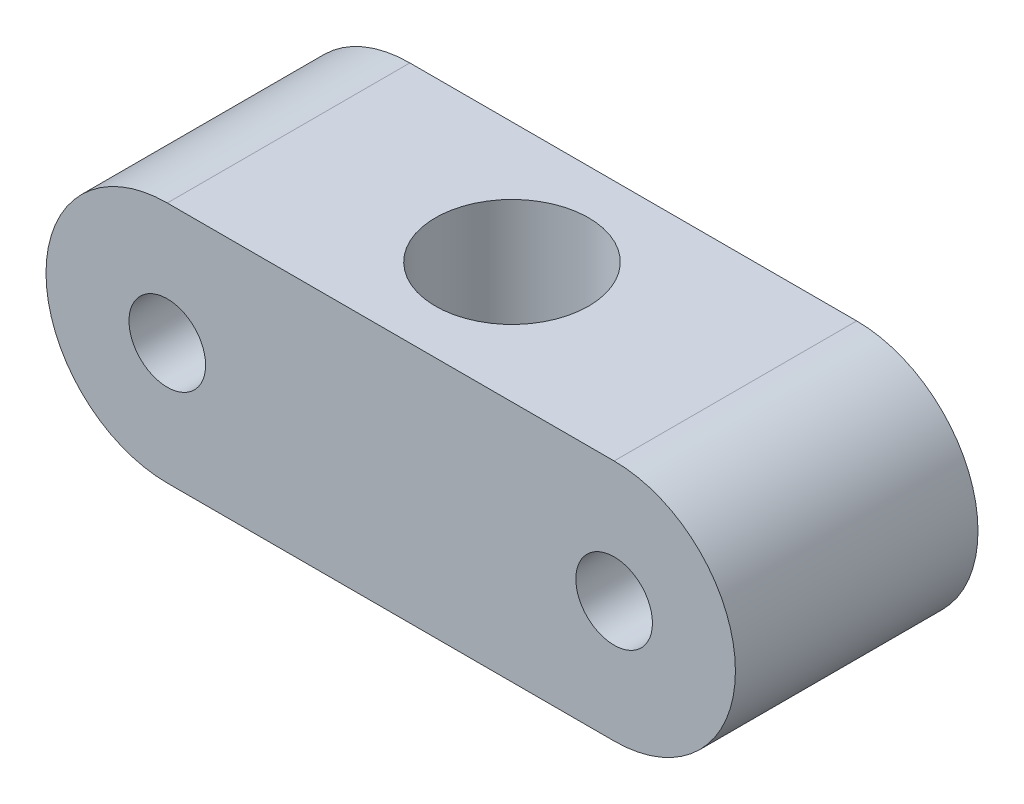
ISO-10303-21;
HEADER;
FILE_DESCRIPTION(('STEP AP214'),'2;1');
FILE_NAME('part.step','',(''),(''),'','','');
FILE_SCHEMA(('AUTOMOTIVE_DESIGN { 1 0 10303 214 1 1 1 1 }'));
ENDSEC;
DATA;
#1=APPLICATION_CONTEXT('core data for automotive mechanical design processes');
#2=APPLICATION_PROTOCOL_DEFINITION('international standard','automotive_design',2000,#1);
#3=PRODUCT_CONTEXT('',#1,'mechanical');
#4=PRODUCT('Part','Part','',(#3));
#5=PRODUCT_RELATED_PRODUCT_CATEGORY('part','',(#4));
#6=PRODUCT_DEFINITION_FORMATION('','',#4);
#7=PRODUCT_DEFINITION_CONTEXT('part definition',#1,'design');
#8=PRODUCT_DEFINITION('design','',#6,#7);
#9=PRODUCT_DEFINITION_SHAPE('','',#8);
#10=(LENGTH_UNIT() NAMED_UNIT(*) SI_UNIT(.MILLI.,.METRE.));
#11=(NAMED_UNIT(*) PLANE_ANGLE_UNIT() SI_UNIT($,.RADIAN.));
#12=(NAMED_UNIT(*) SI_UNIT($,.STERADIAN.) SOLID_ANGLE_UNIT());
#13=UNCERTAINTY_MEASURE_WITH_UNIT(LENGTH_MEASURE(1.E-05),#10,'distance_accuracy_value','');
#14=(GEOMETRIC_REPRESENTATION_CONTEXT(3) GLOBAL_UNCERTAINTY_ASSIGNED_CONTEXT((#13)) GLOBAL_UNIT_ASSIGNED_CONTEXT((#10,
#11,#12)) REPRESENTATION_CONTEXT('',''));
#15=CARTESIAN_POINT('',(0.,0.,0.));
#16=DIRECTION('',(0.,0.,1.));
#17=DIRECTION('',(1.,0.,0.));
#18=AXIS2_PLACEMENT_3D('',#15,#16,#17);
#19=CARTESIAN_POINT('',(-35.,0.,19.));
#20=DIRECTION('',(0.,0.,1.));
#21=DIRECTION('',(1.,0.,0.));
#22=AXIS2_PLACEMENT_3D('',#19,#20,#21);
#23=PLANE('',#22);
#24=CARTESIAN_POINT('',(-35.,0.,19.));
#25=DIRECTION('',(0.,0.,1.));
#26=DIRECTION('',(1.,0.,0.));
#27=AXIS2_PLACEMENT_3D('',#24,#25,#26);
#28=CIRCLE('',#27,6.);
#29=CARTESIAN_POINT('',(-29.,0.,19.));
#30=VERTEX_POINT('',#29);
#31=EDGE_CURVE('E104',#30,#30,#28,.T.);
#32=ORIENTED_EDGE('',*,*,#31,.F.);
#33=EDGE_LOOP('',(#32));
#34=FACE_BOUND('',#33,.T.);
#35=CARTESIAN_POINT('',(-35.,0.,19.));
#36=DIRECTION('',(0.,0.,1.));
#37=DIRECTION('',(1.,0.,0.));
#38=AXIS2_PLACEMENT_3D('',#35,#36,#37);
#39=CIRCLE('',#38,19.);
#40=CARTESIAN_POINT('',(-35.,19.,19.));
#41=VERTEX_POINT('',#40);
#42=CARTESIAN_POINT('',(-35.,-19.,19.));
#43=VERTEX_POINT('',#42);
#44=EDGE_CURVE('E89',#41,#43,#39,.T.);
#45=ORIENTED_EDGE('',*,*,#44,.T.);
#46=DIRECTION('',(1.,0.,0.));
#47=VECTOR('',#46,1.);
#48=CARTESIAN_POINT('',(-35.,-19.,19.));
#49=LINE('',#48,#47);
#50=CARTESIAN_POINT('',(35.,-19.,19.));
#51=VERTEX_POINT('',#50);
#52=EDGE_CURVE('E84',#43,#51,#49,.T.);
#53=ORIENTED_EDGE('',*,*,#52,.T.);
#54=CARTESIAN_POINT('',(35.,0.,19.));
#55=DIRECTION('',(0.,0.,1.));
#56=DIRECTION('',(1.,0.,0.));
#57=AXIS2_PLACEMENT_3D('',#54,#55,#56);
#58=CIRCLE('',#57,19.);
#59=CARTESIAN_POINT('',(35.,19.,19.));
#60=VERTEX_POINT('',#59);
#61=EDGE_CURVE('E87',#51,#60,#58,.T.);
#62=ORIENTED_EDGE('',*,*,#61,.T.);
#63=DIRECTION('',(-1.,0.,0.));
#64=VECTOR('',#63,1.);
#65=CARTESIAN_POINT('',(-35.,19.,19.));
#66=LINE('',#65,#64);
#67=EDGE_CURVE('E54',#60,#41,#66,.T.);
#68=ORIENTED_EDGE('',*,*,#67,.T.);
#69=EDGE_LOOP('',(#45,#53,#62,#68));
#70=FACE_BOUND('',#69,.T.);
#71=CARTESIAN_POINT('',(35.,0.,19.));
#72=DIRECTION('',(0.,0.,1.));
#73=DIRECTION('',(1.,0.,0.));
#74=AXIS2_PLACEMENT_3D('',#71,#72,#73);
#75=CIRCLE('',#74,6.);
#76=CARTESIAN_POINT('',(41.,0.,19.));
#77=VERTEX_POINT('',#76);
#78=EDGE_CURVE('E119',#77,#77,#75,.T.);
#79=ORIENTED_EDGE('',*,*,#78,.F.);
#80=EDGE_LOOP('',(#79));
#81=FACE_BOUND('',#80,.T.);
#82=ADVANCED_FACE('F37',(#34,#70,#81),#23,.T.);
#83=CARTESIAN_POINT('',(-35.,0.,-19.));
#84=DIRECTION('',(0.,0.,1.));
#85=DIRECTION('',(1.,0.,0.));
#86=AXIS2_PLACEMENT_3D('',#83,#84,#85);
#87=PLANE('',#86);
#88=CARTESIAN_POINT('',(-35.,0.,-19.));
#89=DIRECTION('',(0.,0.,1.));
#90=DIRECTION('',(1.,0.,0.));
#91=AXIS2_PLACEMENT_3D('',#88,#89,#90);
#92=CIRCLE('',#91,19.);
#93=CARTESIAN_POINT('',(-35.,19.,-19.));
#94=VERTEX_POINT('',#93);
#95=CARTESIAN_POINT('',(-35.,-19.,-19.));
#96=VERTEX_POINT('',#95);
#97=EDGE_CURVE('E101',#94,#96,#92,.T.);
#98=ORIENTED_EDGE('',*,*,#97,.F.);
#99=DIRECTION('',(-1.,0.,0.));
#100=VECTOR('',#99,1.);
#101=CARTESIAN_POINT('',(-35.,19.,-19.));
#102=LINE('',#101,#100);
#103=CARTESIAN_POINT('',(35.,19.,-19.));
#104=VERTEX_POINT('',#103);
#105=EDGE_CURVE('E77',#104,#94,#102,.T.);
#106=ORIENTED_EDGE('',*,*,#105,.F.);
#107=CARTESIAN_POINT('',(35.,0.,-19.));
#108=DIRECTION('',(0.,0.,1.));
#109=DIRECTION('',(1.,0.,0.));
#110=AXIS2_PLACEMENT_3D('',#107,#108,#109);
#111=CIRCLE('',#110,19.);
#112=CARTESIAN_POINT('',(35.,-19.,-19.));
#113=VERTEX_POINT('',#112);
#114=EDGE_CURVE('E71',#113,#104,#111,.T.);
#115=ORIENTED_EDGE('',*,*,#114,.F.);
#116=DIRECTION('',(1.,0.,0.));
#117=VECTOR('',#116,1.);
#118=CARTESIAN_POINT('',(-35.,-19.,-19.));
#119=LINE('',#118,#117);
#120=EDGE_CURVE('E93',#96,#113,#119,.T.);
#121=ORIENTED_EDGE('',*,*,#120,.F.);
#122=EDGE_LOOP('',(#98,#106,#115,#121));
#123=FACE_BOUND('',#122,.T.);
#124=CARTESIAN_POINT('',(-35.,0.,-19.));
#125=DIRECTION('',(0.,0.,1.));
#126=DIRECTION('',(1.,0.,0.));
#127=AXIS2_PLACEMENT_3D('',#124,#125,#126);
#128=CIRCLE('',#127,6.);
#129=CARTESIAN_POINT('',(-29.,0.,-19.));
#130=VERTEX_POINT('',#129);
#131=EDGE_CURVE('E116',#130,#130,#128,.T.);
#132=ORIENTED_EDGE('',*,*,#131,.T.);
#133=EDGE_LOOP('',(#132));
#134=FACE_BOUND('',#133,.T.);
#135=CARTESIAN_POINT('',(35.,0.,-19.));
#136=DIRECTION('',(0.,0.,1.));
#137=DIRECTION('',(1.,0.,0.));
#138=AXIS2_PLACEMENT_3D('',#135,#136,#137);
#139=CIRCLE('',#138,6.);
#140=CARTESIAN_POINT('',(41.,0.,-19.));
#141=VERTEX_POINT('',#140);
#142=EDGE_CURVE('E122',#141,#141,#139,.T.);
#143=ORIENTED_EDGE('',*,*,#142,.T.);
#144=EDGE_LOOP('',(#143));
#145=FACE_BOUND('',#144,.T.);
#146=ADVANCED_FACE('F112',(#123,#134,#145),#87,.F.);
#147=CARTESIAN_POINT('',(-35.,0.,19.));
#148=DIRECTION('',(0.,0.,-1.));
#149=DIRECTION('',(-1.,0.,0.));
#150=AXIS2_PLACEMENT_3D('',#147,#148,#149);
#151=CYLINDRICAL_SURFACE('',#150,19.);
#152=ORIENTED_EDGE('',*,*,#97,.T.);
#153=DIRECTION('',(0.,0.,-1.));
#154=VECTOR('',#153,1.);
#155=CARTESIAN_POINT('',(-35.,-19.,19.));
#156=LINE('',#155,#154);
#157=EDGE_CURVE('E11',#43,#96,#156,.T.);
#158=ORIENTED_EDGE('',*,*,#157,.F.);
#159=ORIENTED_EDGE('',*,*,#44,.F.);
#160=DIRECTION('',(0.,0.,-1.));
#161=VECTOR('',#160,1.);
#162=CARTESIAN_POINT('',(-35.,19.,19.));
#163=LINE('',#162,#161);
#164=EDGE_CURVE('E97',#41,#94,#163,.T.);
#165=ORIENTED_EDGE('',*,*,#164,.T.);
#166=EDGE_LOOP('',(#152,#158,#159,#165));
#167=FACE_BOUND('',#166,.T.);
#168=ADVANCED_FACE('F39',(#167),#151,.T.);
#169=CARTESIAN_POINT('',(-35.,-19.,19.));
#170=DIRECTION('',(0.,1.,0.));
#171=DIRECTION('',(-1.,0.,0.));
#172=AXIS2_PLACEMENT_3D('',#169,#170,#171);
#173=PLANE('',#172);
#174=CARTESIAN_POINT('',(0.,-19.,0.));
#175=DIRECTION('',(0.,-1.,0.));
#176=DIRECTION('',(1.,0.,0.));
#177=AXIS2_PLACEMENT_3D('',#174,#175,#176);
#178=CIRCLE('',#177,12.);
#179=CARTESIAN_POINT('',(12.,-19.,0.));
#180=VERTEX_POINT('',#179);
#181=EDGE_CURVE('E128',#180,#180,#178,.T.);
#182=ORIENTED_EDGE('',*,*,#181,.F.);
#183=EDGE_LOOP('',(#182));
#184=FACE_BOUND('',#183,.T.);
#185=ORIENTED_EDGE('',*,*,#120,.T.);
#186=DIRECTION('',(0.,0.,-1.));
#187=VECTOR('',#186,1.);
#188=CARTESIAN_POINT('',(35.,-19.,19.));
#189=LINE('',#188,#187);
#190=EDGE_CURVE('E46',#51,#113,#189,.T.);
#191=ORIENTED_EDGE('',*,*,#190,.F.);
#192=ORIENTED_EDGE('',*,*,#52,.F.);
#193=ORIENTED_EDGE('',*,*,#157,.T.);
#194=EDGE_LOOP('',(#185,#191,#192,#193));
#195=FACE_BOUND('',#194,.T.);
#196=ADVANCED_FACE('F92',(#184,#195),#173,.F.);
#197=CARTESIAN_POINT('',(35.,0.,19.));
#198=DIRECTION('',(0.,0.,-1.));
#199=DIRECTION('',(-1.,0.,0.));
#200=AXIS2_PLACEMENT_3D('',#197,#198,#199);
#201=CYLINDRICAL_SURFACE('',#200,19.);
#202=ORIENTED_EDGE('',*,*,#114,.T.);
#203=DIRECTION('',(0.,0.,-1.));
#204=VECTOR('',#203,1.);
#205=CARTESIAN_POINT('',(35.,19.,19.));
#206=LINE('',#205,#204);
#207=EDGE_CURVE('E94',#60,#104,#206,.T.);
#208=ORIENTED_EDGE('',*,*,#207,.F.);
#209=ORIENTED_EDGE('',*,*,#61,.F.);
#210=ORIENTED_EDGE('',*,*,#190,.T.);
#211=EDGE_LOOP('',(#202,#208,#209,#210));
#212=FACE_BOUND('',#211,.T.);
#213=ADVANCED_FACE('F95',(#212),#201,.T.);
#214=CARTESIAN_POINT('',(-35.,19.,19.));
#215=DIRECTION('',(0.,-1.,0.));
#216=DIRECTION('',(1.,0.,0.));
#217=AXIS2_PLACEMENT_3D('',#214,#215,#216);
#218=PLANE('',#217);
#219=CARTESIAN_POINT('',(0.,19.,0.));
#220=DIRECTION('',(0.,-1.,0.));
#221=DIRECTION('',(1.,0.,0.));
#222=AXIS2_PLACEMENT_3D('',#219,#220,#221);
#223=CIRCLE('',#222,12.);
#224=CARTESIAN_POINT('',(12.,19.,0.));
#225=VERTEX_POINT('',#224);
#226=EDGE_CURVE('E125',#225,#225,#223,.T.);
#227=ORIENTED_EDGE('',*,*,#226,.T.);
#228=EDGE_LOOP('',(#227));
#229=FACE_BOUND('',#228,.T.);
#230=ORIENTED_EDGE('',*,*,#105,.T.);
#231=ORIENTED_EDGE('',*,*,#164,.F.);
#232=ORIENTED_EDGE('',*,*,#67,.F.);
#233=ORIENTED_EDGE('',*,*,#207,.T.);
#234=EDGE_LOOP('',(#230,#231,#232,#233));
#235=FACE_BOUND('',#234,.T.);
#236=ADVANCED_FACE('F109',(#229,#235),#218,.F.);
#237=CARTESIAN_POINT('',(-35.,0.,19.));
#238=DIRECTION('',(0.,0.,-1.));
#239=DIRECTION('',(-1.,0.,0.));
#240=AXIS2_PLACEMENT_3D('',#237,#238,#239);
#241=CYLINDRICAL_SURFACE('',#240,6.);
#242=ORIENTED_EDGE('',*,*,#31,.T.);
#243=EDGE_LOOP('',(#242));
#244=FACE_BOUND('',#243,.T.);
#245=ORIENTED_EDGE('',*,*,#131,.F.);
#246=EDGE_LOOP('',(#245));
#247=FACE_BOUND('',#246,.T.);
#248=ADVANCED_FACE('F157',(#244,#247),#241,.F.);
#249=CARTESIAN_POINT('',(35.,0.,19.));
#250=DIRECTION('',(0.,0.,-1.));
#251=DIRECTION('',(-1.,0.,0.));
#252=AXIS2_PLACEMENT_3D('',#249,#250,#251);
#253=CYLINDRICAL_SURFACE('',#252,6.);
#254=ORIENTED_EDGE('',*,*,#78,.T.);
#255=EDGE_LOOP('',(#254));
#256=FACE_BOUND('',#255,.T.);
#257=ORIENTED_EDGE('',*,*,#142,.F.);
#258=EDGE_LOOP('',(#257));
#259=FACE_BOUND('',#258,.T.);
#260=ADVANCED_FACE('F138',(#256,#259),#253,.F.);
#261=CARTESIAN_POINT('',(0.,19.,0.));
#262=DIRECTION('',(0.,-1.,0.));
#263=DIRECTION('',(1.,0.,0.));
#264=AXIS2_PLACEMENT_3D('',#261,#262,#263);
#265=CYLINDRICAL_SURFACE('',#264,12.);
#266=ORIENTED_EDGE('',*,*,#226,.F.);
#267=EDGE_LOOP('',(#266));
#268=FACE_BOUND('',#267,.T.);
#269=ORIENTED_EDGE('',*,*,#181,.T.);
#270=EDGE_LOOP('',(#269));
#271=FACE_BOUND('',#270,.T.);
#272=ADVANCED_FACE('F135',(#268,#271),#265,.F.);
#273=CLOSED_SHELL('',(#82,#146,#168,#196,#213,#236,#248,#260,#272));
#274=MANIFOLD_SOLID_BREP('B2',#273);
#275=ADVANCED_BREP_SHAPE_REPRESENTATION('',(#18,#274),#14);
#276=SHAPE_DEFINITION_REPRESENTATION(#9,#275);
ENDSEC;
END-ISO-10303-21;
